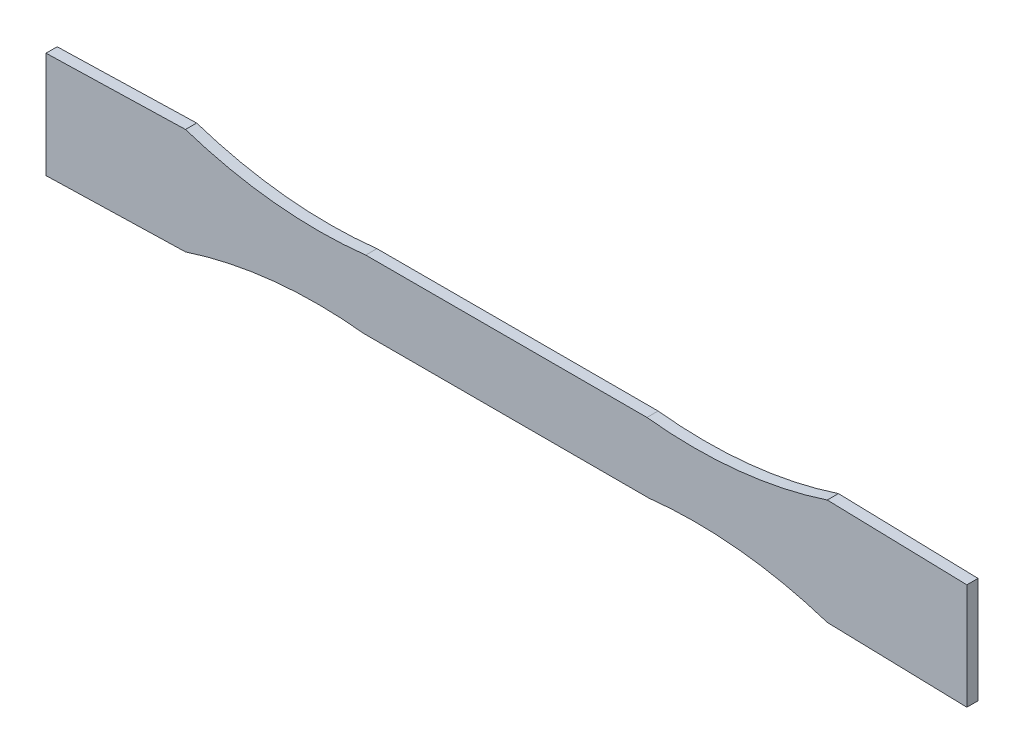
ISO-10303-21;
HEADER;
FILE_DESCRIPTION(('STEP AP214'),'2;1');
FILE_NAME('part.step','',(''),(''),'','','');
FILE_SCHEMA(('AUTOMOTIVE_DESIGN { 1 0 10303 214 1 1 1 1 }'));
ENDSEC;
DATA;
#1=APPLICATION_CONTEXT('core data for automotive mechanical design processes');
#2=APPLICATION_PROTOCOL_DEFINITION('international standard','automotive_design',2000,#1);
#3=PRODUCT_CONTEXT('',#1,'mechanical');
#4=PRODUCT('Part','Part','',(#3));
#5=PRODUCT_RELATED_PRODUCT_CATEGORY('part','',(#4));
#6=PRODUCT_DEFINITION_FORMATION('','',#4);
#7=PRODUCT_DEFINITION_CONTEXT('part definition',#1,'design');
#8=PRODUCT_DEFINITION('design','',#6,#7);
#9=PRODUCT_DEFINITION_SHAPE('','',#8);
#10=(LENGTH_UNIT() NAMED_UNIT(*) SI_UNIT(.MILLI.,.METRE.));
#11=(NAMED_UNIT(*) PLANE_ANGLE_UNIT() SI_UNIT($,.RADIAN.));
#12=(NAMED_UNIT(*) SI_UNIT($,.STERADIAN.) SOLID_ANGLE_UNIT());
#13=UNCERTAINTY_MEASURE_WITH_UNIT(LENGTH_MEASURE(1.E-05),#10,'distance_accuracy_value','');
#14=(GEOMETRIC_REPRESENTATION_CONTEXT(3) GLOBAL_UNCERTAINTY_ASSIGNED_CONTEXT((#13)) GLOBAL_UNIT_ASSIGNED_CONTEXT((#10,
#11,#12)) REPRESENTATION_CONTEXT('',''));
#15=CARTESIAN_POINT('',(0.,0.,0.));
#16=DIRECTION('',(0.,0.,1.));
#17=DIRECTION('',(1.,0.,0.));
#18=AXIS2_PLACEMENT_3D('',#15,#16,#17);
#19=CARTESIAN_POINT('',(0.306287384708204,11.6450756614139,2.));
#20=DIRECTION('',(-0.0262927872209674,-0.999654284910615,0.));
#21=DIRECTION('',(0.999654284910615,-0.0262927872209674,0.));
#22=AXIS2_PLACEMENT_3D('',#19,#20,#21);
#23=PLANE('',#22);
#24=DIRECTION('',(-0.999654284910615,0.0262927872209674,0.));
#25=VECTOR('',#24,1.);
#26=CARTESIAN_POINT('',(0.306287384708204,11.6450756614139,0.));
#27=LINE('',#26,#25);
#28=CARTESIAN_POINT('',(118.382619236994,8.53944612919812,0.));
#29=VERTEX_POINT('',#28);
#30=CARTESIAN_POINT('',(93.3739643892406,9.19722077241228,0.));
#31=VERTEX_POINT('',#30);
#32=EDGE_CURVE('E157',#29,#31,#27,.T.);
#33=ORIENTED_EDGE('',*,*,#32,.T.);
#34=DIRECTION('',(0.,0.,-1.));
#35=VECTOR('',#34,1.);
#36=CARTESIAN_POINT('',(93.3739643892406,9.19722077241228,2.));
#37=LINE('',#36,#35);
#38=CARTESIAN_POINT('',(93.3739643892406,9.19722077241228,2.));
#39=VERTEX_POINT('',#38);
#40=EDGE_CURVE('E11',#39,#31,#37,.T.);
#41=ORIENTED_EDGE('',*,*,#40,.F.);
#42=DIRECTION('',(-0.999654284910615,0.0262927872209674,0.));
#43=VECTOR('',#42,1.);
#44=CARTESIAN_POINT('',(0.306287384708204,11.6450756614139,2.));
#45=LINE('',#44,#43);
#46=CARTESIAN_POINT('',(118.382619236994,8.53944612919812,2.));
#47=VERTEX_POINT('',#46);
#48=EDGE_CURVE('E186',#47,#39,#45,.T.);
#49=ORIENTED_EDGE('',*,*,#48,.F.);
#50=DIRECTION('',(0.,0.,-1.));
#51=VECTOR('',#50,1.);
#52=CARTESIAN_POINT('',(118.382619236994,8.53944612919812,2.));
#53=LINE('',#52,#51);
#54=EDGE_CURVE('E53',#47,#29,#53,.T.);
#55=ORIENTED_EDGE('',*,*,#54,.T.);
#56=EDGE_LOOP('',(#33,#41,#49,#55));
#57=FACE_BOUND('',#56,.T.);
#58=ADVANCED_FACE('F37',(#57),#23,.F.);
#59=CARTESIAN_POINT('',(69.5821339937692,81.3771958793152,2.));
#60=DIRECTION('',(0.,0.,-1.));
#61=DIRECTION('',(-1.,0.,0.));
#62=AXIS2_PLACEMENT_3D('',#59,#60,#61);
#63=CYLINDRICAL_SURFACE('',#62,76.);
#64=CARTESIAN_POINT('',(69.5821339937692,81.3771958793152,0.));
#65=DIRECTION('',(0.,0.,1.));
#66=DIRECTION('',(1.,0.,0.));
#67=AXIS2_PLACEMENT_3D('',#64,#65,#66);
#68=CIRCLE('',#67,76.);
#69=CARTESIAN_POINT('',(61.0678248014905,5.85563247535567,0.));
#70=VERTEX_POINT('',#69);
#71=EDGE_CURVE('E159',#31,#70,#68,.F.);
#72=ORIENTED_EDGE('',*,*,#71,.T.);
#73=DIRECTION('',(0.,0.,-1.));
#74=VECTOR('',#73,1.);
#75=CARTESIAN_POINT('',(61.0678248014905,5.85563247535567,2.));
#76=LINE('',#75,#74);
#77=CARTESIAN_POINT('',(61.0678248014905,5.85563247535567,2.));
#78=VERTEX_POINT('',#77);
#79=EDGE_CURVE('E45',#78,#70,#76,.T.);
#80=ORIENTED_EDGE('',*,*,#79,.F.);
#81=CARTESIAN_POINT('',(69.5821339937692,81.3771958793152,2.));
#82=DIRECTION('',(0.,0.,1.));
#83=DIRECTION('',(1.,0.,0.));
#84=AXIS2_PLACEMENT_3D('',#81,#82,#83);
#85=CIRCLE('',#84,76.);
#86=EDGE_CURVE('E103',#39,#78,#85,.F.);
#87=ORIENTED_EDGE('',*,*,#86,.F.);
#88=ORIENTED_EDGE('',*,*,#40,.T.);
#89=EDGE_LOOP('',(#72,#80,#87,#88));
#90=FACE_BOUND('',#89,.T.);
#91=ADVANCED_FACE('F210',(#90),#63,.F.);
#92=CARTESIAN_POINT('',(0.,5.85563247535567,2.));
#93=DIRECTION('',(0.,1.,0.));
#94=DIRECTION('',(0.,0.,1.));
#95=AXIS2_PLACEMENT_3D('',#92,#93,#94);
#96=PLANE('',#95);
#97=DIRECTION('',(1.,0.,0.));
#98=VECTOR('',#97,1.);
#99=CARTESIAN_POINT('',(0.,5.85563247535567,0.));
#100=LINE('',#99,#98);
#101=CARTESIAN_POINT('',(10.6759845941212,5.85563247535567,0.));
#102=VERTEX_POINT('',#101);
#103=EDGE_CURVE('E162',#102,#70,#100,.T.);
#104=ORIENTED_EDGE('',*,*,#103,.F.);
#105=DIRECTION('',(0.,0.,-1.));
#106=VECTOR('',#105,1.);
#107=CARTESIAN_POINT('',(10.6759845941212,5.85563247535567,2.));
#108=LINE('',#107,#106);
#109=CARTESIAN_POINT('',(10.6759845941212,5.85563247535567,2.));
#110=VERTEX_POINT('',#109);
#111=EDGE_CURVE('E203',#110,#102,#108,.T.);
#112=ORIENTED_EDGE('',*,*,#111,.F.);
#113=DIRECTION('',(1.,0.,0.));
#114=VECTOR('',#113,1.);
#115=CARTESIAN_POINT('',(0.,5.85563247535567,2.));
#116=LINE('',#115,#114);
#117=EDGE_CURVE('E209',#110,#78,#116,.T.);
#118=ORIENTED_EDGE('',*,*,#117,.T.);
#119=ORIENTED_EDGE('',*,*,#79,.T.);
#120=EDGE_LOOP('',(#104,#112,#118,#119));
#121=FACE_BOUND('',#120,.T.);
#122=ADVANCED_FACE('F207',(#121),#96,.T.);
#123=CARTESIAN_POINT('',(2.16474503614541,81.3775418870406,2.));
#124=DIRECTION('',(0.,0.,-1.));
#125=DIRECTION('',(-1.,0.,0.));
#126=AXIS2_PLACEMENT_3D('',#123,#124,#125);
#127=CYLINDRICAL_SURFACE('',#126,76.);
#128=CARTESIAN_POINT('',(2.16474503614541,81.3775418870406,0.));
#129=DIRECTION('',(0.,0.,1.));
#130=DIRECTION('',(1.,0.,0.));
#131=AXIS2_PLACEMENT_3D('',#128,#129,#130);
#132=CIRCLE('',#131,76.);
#133=CARTESIAN_POINT('',(-21.6260356107594,9.19722077241228,0.));
#134=VERTEX_POINT('',#133);
#135=EDGE_CURVE('E165',#134,#102,#132,.T.);
#136=ORIENTED_EDGE('',*,*,#135,.F.);
#137=DIRECTION('',(0.,0.,-1.));
#138=VECTOR('',#137,1.);
#139=CARTESIAN_POINT('',(-21.6260356107594,9.19722077241228,2.));
#140=LINE('',#139,#138);
#141=CARTESIAN_POINT('',(-21.6260356107594,9.19722077241228,2.));
#142=VERTEX_POINT('',#141);
#143=EDGE_CURVE('E201',#142,#134,#140,.T.);
#144=ORIENTED_EDGE('',*,*,#143,.F.);
#145=CARTESIAN_POINT('',(2.16474503614541,81.3775418870406,2.));
#146=DIRECTION('',(0.,0.,1.));
#147=DIRECTION('',(1.,0.,0.));
#148=AXIS2_PLACEMENT_3D('',#145,#146,#147);
#149=CIRCLE('',#148,76.);
#150=EDGE_CURVE('E221',#142,#110,#149,.T.);
#151=ORIENTED_EDGE('',*,*,#150,.T.);
#152=ORIENTED_EDGE('',*,*,#111,.T.);
#153=EDGE_LOOP('',(#136,#144,#151,#152));
#154=FACE_BOUND('',#153,.T.);
#155=ADVANCED_FACE('F218',(#154),#127,.F.);
#156=CARTESIAN_POINT('',(-0.256875181504309,9.75965916024253,2.));
#157=DIRECTION('',(-0.0263109857285662,0.999653806089884,0.));
#158=DIRECTION('',(-0.999653806089884,-0.0263109857285662,0.));
#159=AXIS2_PLACEMENT_3D('',#156,#157,#158);
#160=PLANE('',#159);
#161=DIRECTION('',(0.999653806089884,0.0263109857285662,0.));
#162=VECTOR('',#161,1.);
#163=CARTESIAN_POINT('',(-0.256875181504309,9.75965916024253,0.));
#164=LINE('',#163,#162);
#165=CARTESIAN_POINT('',(-46.6173807630065,8.53944612919812,0.));
#166=VERTEX_POINT('',#165);
#167=EDGE_CURVE('E168',#166,#134,#164,.T.);
#168=ORIENTED_EDGE('',*,*,#167,.F.);
#169=DIRECTION('',(0.,0.,-1.));
#170=VECTOR('',#169,1.);
#171=CARTESIAN_POINT('',(-46.6173807630065,8.53944612919812,2.));
#172=LINE('',#171,#170);
#173=CARTESIAN_POINT('',(-46.6173807630065,8.53944612919812,2.));
#174=VERTEX_POINT('',#173);
#175=EDGE_CURVE('E199',#174,#166,#172,.T.);
#176=ORIENTED_EDGE('',*,*,#175,.F.);
#177=DIRECTION('',(0.999653806089884,0.0263109857285662,0.));
#178=VECTOR('',#177,1.);
#179=CARTESIAN_POINT('',(-0.256875181504309,9.75965916024253,2.));
#180=LINE('',#179,#178);
#181=EDGE_CURVE('E225',#174,#142,#180,.T.);
#182=ORIENTED_EDGE('',*,*,#181,.T.);
#183=ORIENTED_EDGE('',*,*,#143,.T.);
#184=EDGE_LOOP('',(#168,#176,#182,#183));
#185=FACE_BOUND('',#184,.T.);
#186=ADVANCED_FACE('F267',(#185),#160,.T.);
#187=CARTESIAN_POINT('',(-46.6173807630065,0.,2.));
#188=DIRECTION('',(1.,0.,0.));
#189=DIRECTION('',(0.,0.,-1.));
#190=AXIS2_PLACEMENT_3D('',#187,#188,#189);
#191=PLANE('',#190);
#192=DIRECTION('',(0.,-1.,0.));
#193=VECTOR('',#192,1.);
#194=CARTESIAN_POINT('',(-46.6173807630065,0.,0.));
#195=LINE('',#194,#193);
#196=CARTESIAN_POINT('',(-46.6173807630065,-10.4605538708019,0.));
#197=VERTEX_POINT('',#196);
#198=EDGE_CURVE('E171',#166,#197,#195,.T.);
#199=ORIENTED_EDGE('',*,*,#198,.T.);
#200=DIRECTION('',(0.,0.,-1.));
#201=VECTOR('',#200,1.);
#202=CARTESIAN_POINT('',(-46.6173807630065,-10.4605538708019,2.));
#203=LINE('',#202,#201);
#204=CARTESIAN_POINT('',(-46.6173807630065,-10.4605538708019,2.));
#205=VERTEX_POINT('',#204);
#206=EDGE_CURVE('E196',#205,#197,#203,.T.);
#207=ORIENTED_EDGE('',*,*,#206,.F.);
#208=DIRECTION('',(0.,-1.,0.));
#209=VECTOR('',#208,1.);
#210=CARTESIAN_POINT('',(-46.6173807630065,0.,2.));
#211=LINE('',#210,#209);
#212=EDGE_CURVE('E231',#174,#205,#211,.T.);
#213=ORIENTED_EDGE('',*,*,#212,.F.);
#214=ORIENTED_EDGE('',*,*,#175,.T.);
#215=EDGE_LOOP('',(#199,#207,#213,#214));
#216=FACE_BOUND('',#215,.T.);
#217=ADVANCED_FACE('F270',(#216),#191,.F.);
#218=CARTESIAN_POINT('',(0.24286048198091,-9.2271877483273,2.));
#219=DIRECTION('',(-0.0263109857285662,0.999653806089884,0.));
#220=DIRECTION('',(-0.999653806089884,-0.0263109857285662,0.));
#221=AXIS2_PLACEMENT_3D('',#218,#219,#220);
#222=PLANE('',#221);
#223=DIRECTION('',(0.999653806089884,0.0263109857285662,0.));
#224=VECTOR('',#223,1.);
#225=CARTESIAN_POINT('',(0.24286048198091,-9.2271877483273,0.));
#226=LINE('',#225,#224);
#227=CARTESIAN_POINT('',(-21.6260356107594,-9.80277922758772,0.));
#228=VERTEX_POINT('',#227);
#229=EDGE_CURVE('E173',#197,#228,#226,.T.);
#230=ORIENTED_EDGE('',*,*,#229,.T.);
#231=DIRECTION('',(0.,0.,-1.));
#232=VECTOR('',#231,1.);
#233=CARTESIAN_POINT('',(-21.6260356107594,-9.80277922758772,2.));
#234=LINE('',#233,#232);
#235=CARTESIAN_POINT('',(-21.6260356107594,-9.80277922758772,2.));
#236=VERTEX_POINT('',#235);
#237=EDGE_CURVE('E193',#236,#228,#234,.T.);
#238=ORIENTED_EDGE('',*,*,#237,.F.);
#239=DIRECTION('',(0.999653806089884,0.0263109857285662,0.));
#240=VECTOR('',#239,1.);
#241=CARTESIAN_POINT('',(0.24286048198091,-9.2271877483273,2.));
#242=LINE('',#241,#240);
#243=EDGE_CURVE('E233',#205,#236,#242,.T.);
#244=ORIENTED_EDGE('',*,*,#243,.F.);
#245=ORIENTED_EDGE('',*,*,#206,.T.);
#246=EDGE_LOOP('',(#230,#238,#244,#245));
#247=FACE_BOUND('',#246,.T.);
#248=ADVANCED_FACE('F274',(#247),#222,.F.);
#249=CARTESIAN_POINT('',(2.00700801727326,-82.0348998449108,2.));
#250=DIRECTION('',(0.,0.,-1.));
#251=DIRECTION('',(-1.,0.,0.));
#252=AXIS2_PLACEMENT_3D('',#249,#250,#251);
#253=CYLINDRICAL_SURFACE('',#252,76.);
#254=CARTESIAN_POINT('',(2.00700801727326,-82.0348998449108,0.));
#255=DIRECTION('',(0.,0.,1.));
#256=DIRECTION('',(1.,0.,0.));
#257=AXIS2_PLACEMENT_3D('',#254,#255,#256);
#258=CIRCLE('',#257,76.);
#259=CARTESIAN_POINT('',(10.3532472068132,-6.49457755680435,0.));
#260=VERTEX_POINT('',#259);
#261=EDGE_CURVE('E175',#228,#260,#258,.F.);
#262=ORIENTED_EDGE('',*,*,#261,.T.);
#263=DIRECTION('',(0.,0.,-1.));
#264=VECTOR('',#263,1.);
#265=CARTESIAN_POINT('',(10.3532472068132,-6.49457755680435,2.));
#266=LINE('',#265,#264);
#267=CARTESIAN_POINT('',(10.3532472068132,-6.49457755680435,2.));
#268=VERTEX_POINT('',#267);
#269=EDGE_CURVE('E190',#268,#260,#266,.T.);
#270=ORIENTED_EDGE('',*,*,#269,.F.);
#271=CARTESIAN_POINT('',(2.00700801727326,-82.0348998449108,2.));
#272=DIRECTION('',(0.,0.,1.));
#273=DIRECTION('',(1.,0.,0.));
#274=AXIS2_PLACEMENT_3D('',#271,#272,#273);
#275=CIRCLE('',#274,76.);
#276=EDGE_CURVE('E235',#236,#268,#275,.F.);
#277=ORIENTED_EDGE('',*,*,#276,.F.);
#278=ORIENTED_EDGE('',*,*,#237,.T.);
#279=EDGE_LOOP('',(#262,#270,#277,#278));
#280=FACE_BOUND('',#279,.T.);
#281=ADVANCED_FACE('F241',(#280),#253,.F.);
#282=CARTESIAN_POINT('',(0.,-6.49457755680435,2.));
#283=DIRECTION('',(0.,1.,0.));
#284=DIRECTION('',(0.,0.,1.));
#285=AXIS2_PLACEMENT_3D('',#282,#283,#284);
#286=PLANE('',#285);
#287=DIRECTION('',(1.,0.,0.));
#288=VECTOR('',#287,1.);
#289=CARTESIAN_POINT('',(0.,-6.49457755680435,0.));
#290=LINE('',#289,#288);
#291=CARTESIAN_POINT('',(61.3905621887986,-6.49457755680435,0.));
#292=VERTEX_POINT('',#291);
#293=EDGE_CURVE('E177',#260,#292,#290,.T.);
#294=ORIENTED_EDGE('',*,*,#293,.T.);
#295=DIRECTION('',(0.,0.,-1.));
#296=VECTOR('',#295,1.);
#297=CARTESIAN_POINT('',(61.3905621887986,-6.49457755680435,2.));
#298=LINE('',#297,#296);
#299=CARTESIAN_POINT('',(61.3905621887986,-6.49457755680435,2.));
#300=VERTEX_POINT('',#299);
#301=EDGE_CURVE('E140',#300,#292,#298,.T.);
#302=ORIENTED_EDGE('',*,*,#301,.F.);
#303=DIRECTION('',(1.,0.,0.));
#304=VECTOR('',#303,1.);
#305=CARTESIAN_POINT('',(0.,-6.49457755680435,2.));
#306=LINE('',#305,#304);
#307=EDGE_CURVE('E148',#268,#300,#306,.T.);
#308=ORIENTED_EDGE('',*,*,#307,.F.);
#309=ORIENTED_EDGE('',*,*,#269,.T.);
#310=EDGE_LOOP('',(#294,#302,#308,#309));
#311=FACE_BOUND('',#310,.T.);
#312=ADVANCED_FACE('F245',(#311),#286,.F.);
#313=CARTESIAN_POINT('',(69.7528173878932,-82.0331285621368,2.));
#314=DIRECTION('',(0.,0.,-1.));
#315=DIRECTION('',(-1.,0.,0.));
#316=AXIS2_PLACEMENT_3D('',#313,#314,#315);
#317=CYLINDRICAL_SURFACE('',#316,76.);
#318=CARTESIAN_POINT('',(69.7528173878932,-82.0331285621368,0.));
#319=DIRECTION('',(0.,0.,1.));
#320=DIRECTION('',(1.,0.,0.));
#321=AXIS2_PLACEMENT_3D('',#318,#319,#320);
#322=CIRCLE('',#321,76.);
#323=CARTESIAN_POINT('',(93.3912740847464,-9.80277922758773,0.));
#324=VERTEX_POINT('',#323);
#325=EDGE_CURVE('E136',#324,#292,#322,.T.);
#326=ORIENTED_EDGE('',*,*,#325,.F.);
#327=DIRECTION('',(0.,0.,-1.));
#328=VECTOR('',#327,1.);
#329=CARTESIAN_POINT('',(93.3912740847464,-9.80277922758773,2.));
#330=LINE('',#329,#328);
#331=CARTESIAN_POINT('',(93.3912740847464,-9.80277922758773,2.));
#332=VERTEX_POINT('',#331);
#333=EDGE_CURVE('E131',#332,#324,#330,.T.);
#334=ORIENTED_EDGE('',*,*,#333,.F.);
#335=CARTESIAN_POINT('',(69.7528173878932,-82.0331285621368,2.));
#336=DIRECTION('',(0.,0.,1.));
#337=DIRECTION('',(1.,0.,0.));
#338=AXIS2_PLACEMENT_3D('',#335,#336,#337);
#339=CIRCLE('',#338,76.);
#340=EDGE_CURVE('E134',#332,#300,#339,.T.);
#341=ORIENTED_EDGE('',*,*,#340,.T.);
#342=ORIENTED_EDGE('',*,*,#301,.T.);
#343=EDGE_LOOP('',(#326,#334,#341,#342));
#344=FACE_BOUND('',#343,.T.);
#345=ADVANCED_FACE('F133',(#344),#317,.F.);
#346=CARTESIAN_POINT('',(-0.193179706025324,-7.33962727127612,2.));
#347=DIRECTION('',(-0.0263109857285661,-0.999653806089884,0.));
#348=DIRECTION('',(0.999653806089884,-0.0263109857285661,0.));
#349=AXIS2_PLACEMENT_3D('',#346,#347,#348);
#350=PLANE('',#349);
#351=DIRECTION('',(-0.999653806089884,0.0263109857285661,0.));
#352=VECTOR('',#351,1.);
#353=CARTESIAN_POINT('',(-0.193179706025324,-7.33962727127612,0.));
#354=LINE('',#353,#352);
#355=CARTESIAN_POINT('',(118.382619236994,-10.4605538708019,0.));
#356=VERTEX_POINT('',#355);
#357=EDGE_CURVE('E181',#356,#324,#354,.T.);
#358=ORIENTED_EDGE('',*,*,#357,.F.);
#359=DIRECTION('',(0.,0.,-1.));
#360=VECTOR('',#359,1.);
#361=CARTESIAN_POINT('',(118.382619236994,-10.4605538708019,2.));
#362=LINE('',#361,#360);
#363=CARTESIAN_POINT('',(118.382619236994,-10.4605538708019,2.));
#364=VERTEX_POINT('',#363);
#365=EDGE_CURVE('E91',#364,#356,#362,.T.);
#366=ORIENTED_EDGE('',*,*,#365,.F.);
#367=DIRECTION('',(-0.999653806089884,0.0263109857285661,0.));
#368=VECTOR('',#367,1.);
#369=CARTESIAN_POINT('',(-0.193179706025324,-7.33962727127612,2.));
#370=LINE('',#369,#368);
#371=EDGE_CURVE('E146',#364,#332,#370,.T.);
#372=ORIENTED_EDGE('',*,*,#371,.T.);
#373=ORIENTED_EDGE('',*,*,#333,.T.);
#374=EDGE_LOOP('',(#358,#366,#372,#373));
#375=FACE_BOUND('',#374,.T.);
#376=ADVANCED_FACE('F151',(#375),#350,.T.);
#377=CARTESIAN_POINT('',(118.382619236994,0.,2.));
#378=DIRECTION('',(1.,0.,0.));
#379=DIRECTION('',(0.,0.,-1.));
#380=AXIS2_PLACEMENT_3D('',#377,#378,#379);
#381=PLANE('',#380);
#382=DIRECTION('',(0.,-1.,0.));
#383=VECTOR('',#382,1.);
#384=CARTESIAN_POINT('',(118.382619236994,0.,0.));
#385=LINE('',#384,#383);
#386=EDGE_CURVE('E183',#29,#356,#385,.T.);
#387=ORIENTED_EDGE('',*,*,#386,.F.);
#388=ORIENTED_EDGE('',*,*,#54,.F.);
#389=DIRECTION('',(0.,-1.,0.));
#390=VECTOR('',#389,1.);
#391=CARTESIAN_POINT('',(118.382619236994,0.,2.));
#392=LINE('',#391,#390);
#393=EDGE_CURVE('E152',#47,#364,#392,.T.);
#394=ORIENTED_EDGE('',*,*,#393,.T.);
#395=ORIENTED_EDGE('',*,*,#365,.T.);
#396=EDGE_LOOP('',(#387,#388,#394,#395));
#397=FACE_BOUND('',#396,.T.);
#398=ADVANCED_FACE('F246',(#397),#381,.T.);
#399=CARTESIAN_POINT('',(0.,0.,2.));
#400=DIRECTION('',(0.,0.,1.));
#401=DIRECTION('',(1.,0.,0.));
#402=AXIS2_PLACEMENT_3D('',#399,#400,#401);
#403=PLANE('',#402);
#404=ORIENTED_EDGE('',*,*,#48,.T.);
#405=ORIENTED_EDGE('',*,*,#86,.T.);
#406=ORIENTED_EDGE('',*,*,#117,.F.);
#407=ORIENTED_EDGE('',*,*,#150,.F.);
#408=ORIENTED_EDGE('',*,*,#181,.F.);
#409=ORIENTED_EDGE('',*,*,#212,.T.);
#410=ORIENTED_EDGE('',*,*,#243,.T.);
#411=ORIENTED_EDGE('',*,*,#276,.T.);
#412=ORIENTED_EDGE('',*,*,#307,.T.);
#413=ORIENTED_EDGE('',*,*,#340,.F.);
#414=ORIENTED_EDGE('',*,*,#371,.F.);
#415=ORIENTED_EDGE('',*,*,#393,.F.);
#416=EDGE_LOOP('',(#404,#405,#406,#407,#408,#409,#410,#411,#412,#413,#414,#415));
#417=FACE_BOUND('',#416,.T.);
#418=ADVANCED_FACE('F144',(#417),#403,.T.);
#419=CARTESIAN_POINT('',(0.,0.,0.));
#420=DIRECTION('',(0.,0.,1.));
#421=DIRECTION('',(1.,0.,0.));
#422=AXIS2_PLACEMENT_3D('',#419,#420,#421);
#423=PLANE('',#422);
#424=ORIENTED_EDGE('',*,*,#32,.F.);
#425=ORIENTED_EDGE('',*,*,#386,.T.);
#426=ORIENTED_EDGE('',*,*,#357,.T.);
#427=ORIENTED_EDGE('',*,*,#325,.T.);
#428=ORIENTED_EDGE('',*,*,#293,.F.);
#429=ORIENTED_EDGE('',*,*,#261,.F.);
#430=ORIENTED_EDGE('',*,*,#229,.F.);
#431=ORIENTED_EDGE('',*,*,#198,.F.);
#432=ORIENTED_EDGE('',*,*,#167,.T.);
#433=ORIENTED_EDGE('',*,*,#135,.T.);
#434=ORIENTED_EDGE('',*,*,#103,.T.);
#435=ORIENTED_EDGE('',*,*,#71,.F.);
#436=EDGE_LOOP('',(#424,#425,#426,#427,#428,#429,#430,#431,#432,#433,#434,#435));
#437=FACE_BOUND('',#436,.T.);
#438=ADVANCED_FACE('F213',(#437),#423,.F.);
#439=CLOSED_SHELL('',(#58,#91,#122,#155,#186,#217,#248,#281,#312,#345,#376,#398,#418,#438));
#440=MANIFOLD_SOLID_BREP('B2',#439);
#441=ADVANCED_BREP_SHAPE_REPRESENTATION('',(#18,#440),#14);
#442=SHAPE_DEFINITION_REPRESENTATION(#9,#441);
ENDSEC;
END-ISO-10303-21;
